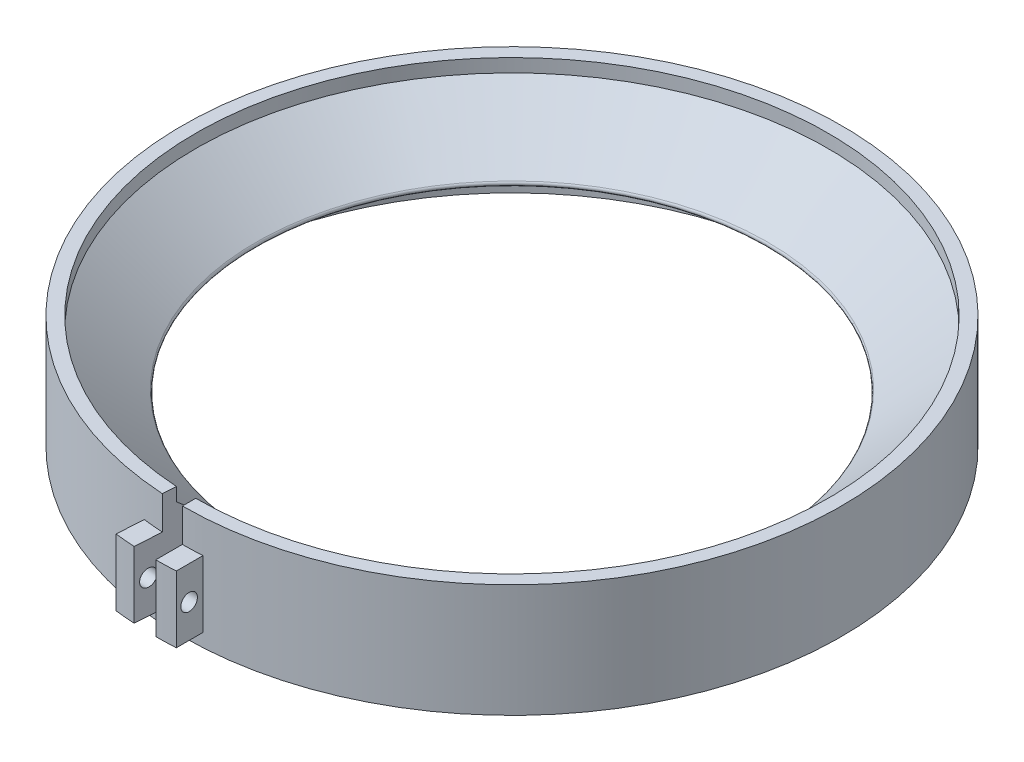
ISO-10303-21;
HEADER;
FILE_DESCRIPTION(('STEP AP214'),'2;1');
FILE_NAME('part.step','',(''),(''),'','','');
FILE_SCHEMA(('AUTOMOTIVE_DESIGN { 1 0 10303 214 1 1 1 1 }'));
ENDSEC;
DATA;
#1=APPLICATION_CONTEXT('core data for automotive mechanical design processes');
#2=APPLICATION_PROTOCOL_DEFINITION('international standard','automotive_design',2000,#1);
#3=PRODUCT_CONTEXT('',#1,'mechanical');
#4=PRODUCT('Part','Part','',(#3));
#5=PRODUCT_RELATED_PRODUCT_CATEGORY('part','',(#4));
#6=PRODUCT_DEFINITION_FORMATION('','',#4);
#7=PRODUCT_DEFINITION_CONTEXT('part definition',#1,'design');
#8=PRODUCT_DEFINITION('design','',#6,#7);
#9=PRODUCT_DEFINITION_SHAPE('','',#8);
#10=(LENGTH_UNIT() NAMED_UNIT(*) SI_UNIT(.MILLI.,.METRE.));
#11=(NAMED_UNIT(*) PLANE_ANGLE_UNIT() SI_UNIT($,.RADIAN.));
#12=(NAMED_UNIT(*) SI_UNIT($,.STERADIAN.) SOLID_ANGLE_UNIT());
#13=UNCERTAINTY_MEASURE_WITH_UNIT(LENGTH_MEASURE(1.E-05),#10,'distance_accuracy_value','');
#14=(GEOMETRIC_REPRESENTATION_CONTEXT(3) GLOBAL_UNCERTAINTY_ASSIGNED_CONTEXT((#13)) GLOBAL_UNIT_ASSIGNED_CONTEXT((#10,
#11,#12)) REPRESENTATION_CONTEXT('',''));
#15=CARTESIAN_POINT('',(0.,0.,0.));
#16=DIRECTION('',(0.,0.,1.));
#17=DIRECTION('',(1.,0.,0.));
#18=AXIS2_PLACEMENT_3D('',#15,#16,#17);
#19=CARTESIAN_POINT('',(38.6587532118802,150.091995488679,0.));
#20=DIRECTION('',(0.,-1.,0.));
#21=DIRECTION('',(0.,0.,-1.));
#22=AXIS2_PLACEMENT_3D('',#19,#20,#21);
#23=CYLINDRICAL_SURFACE('',#22,49.53);
#24=DIRECTION('',(0.,-1.,0.));
#25=VECTOR('',#24,1.);
#26=CARTESIAN_POINT('',(38.6587532118802,150.091995488679,49.53));
#27=LINE('',#26,#25);
#28=CARTESIAN_POINT('',(38.6587532118802,10.,49.53));
#29=VERTEX_POINT('',#28);
#30=CARTESIAN_POINT('',(38.6587532118802,5.00000000000006,49.53));
#31=VERTEX_POINT('',#30);
#32=EDGE_CURVE('E261',#29,#31,#27,.T.);
#33=ORIENTED_EDGE('',*,*,#32,.T.);
#34=CARTESIAN_POINT('',(38.6587532118802,5.,0.));
#35=DIRECTION('',(0.,1.,0.));
#36=DIRECTION('',(0.,0.,1.));
#37=AXIS2_PLACEMENT_3D('',#34,#35,#36);
#38=CIRCLE('',#37,49.53);
#39=CARTESIAN_POINT('',(41.6587532118802,5.,49.4390624911112));
#40=VERTEX_POINT('',#39);
#41=EDGE_CURVE('E65',#31,#40,#38,.T.);
#42=ORIENTED_EDGE('',*,*,#41,.T.);
#43=DIRECTION('',(0.,-1.,0.));
#44=VECTOR('',#43,1.);
#45=CARTESIAN_POINT('',(41.6587532118802,5.,49.4390624911112));
#46=LINE('',#45,#44);
#47=CARTESIAN_POINT('',(41.6587532118802,-5.,49.4390624911112));
#48=VERTEX_POINT('',#47);
#49=EDGE_CURVE('E70',#40,#48,#46,.T.);
#50=ORIENTED_EDGE('',*,*,#49,.T.);
#51=CARTESIAN_POINT('',(38.6587532118802,-5.,0.));
#52=DIRECTION('',(0.,1.,0.));
#53=DIRECTION('',(0.,0.,1.));
#54=AXIS2_PLACEMENT_3D('',#51,#52,#53);
#55=CIRCLE('',#54,49.53);
#56=CARTESIAN_POINT('',(38.6587532118802,-5.,49.53));
#57=VERTEX_POINT('',#56);
#58=EDGE_CURVE('E180',#57,#48,#55,.T.);
#59=ORIENTED_EDGE('',*,*,#58,.F.);
#60=CARTESIAN_POINT('',(38.6587532118802,-7.00000000000001,49.53));
#61=VERTEX_POINT('',#60);
#62=EDGE_CURVE('E260',#57,#61,#27,.T.);
#63=ORIENTED_EDGE('',*,*,#62,.T.);
#64=CARTESIAN_POINT('',(38.6587532118802,-7.00000000000001,0.));
#65=DIRECTION('',(0.,-1.,0.));
#66=DIRECTION('',(0.,0.,-1.));
#67=AXIS2_PLACEMENT_3D('',#64,#65,#66);
#68=CIRCLE('',#67,49.53);
#69=CARTESIAN_POINT('',(35.5487387795933,-7.00000000000001,49.4322638590523));
#70=VERTEX_POINT('',#69);
#71=EDGE_CURVE('E304',#61,#70,#68,.F.);
#72=ORIENTED_EDGE('',*,*,#71,.T.);
#73=DIRECTION('',(0.,-1.,0.));
#74=VECTOR('',#73,1.);
#75=CARTESIAN_POINT('',(35.5487387795933,150.091995488679,49.4322638590523));
#76=LINE('',#75,#74);
#77=CARTESIAN_POINT('',(35.5487387795933,-4.99999999999995,49.4322638590523));
#78=VERTEX_POINT('',#77);
#79=EDGE_CURVE('E277',#70,#78,#76,.F.);
#80=ORIENTED_EDGE('',*,*,#79,.T.);
#81=CARTESIAN_POINT('',(38.6587532118802,-5.,0.));
#82=DIRECTION('',(0.,1.,0.));
#83=DIRECTION('',(0.,0.,1.));
#84=AXIS2_PLACEMENT_3D('',#81,#82,#83);
#85=CIRCLE('',#84,49.53);
#86=CARTESIAN_POINT('',(32.5603686077363,-5.,49.1531342359767));
#87=VERTEX_POINT('',#86);
#88=EDGE_CURVE('E212',#87,#78,#85,.T.);
#89=ORIENTED_EDGE('',*,*,#88,.F.);
#90=DIRECTION('',(0.,-1.,0.));
#91=VECTOR('',#90,1.);
#92=CARTESIAN_POINT('',(32.5603686077363,5.,49.1531342359767));
#93=LINE('',#92,#91);
#94=CARTESIAN_POINT('',(32.5603686077363,5.,49.1531342359767));
#95=VERTEX_POINT('',#94);
#96=EDGE_CURVE('E199',#95,#87,#93,.T.);
#97=ORIENTED_EDGE('',*,*,#96,.F.);
#98=CARTESIAN_POINT('',(38.6587532118802,5.,0.));
#99=DIRECTION('',(0.,1.,0.));
#100=DIRECTION('',(0.,0.,1.));
#101=AXIS2_PLACEMENT_3D('',#98,#99,#100);
#102=CIRCLE('',#101,49.53);
#103=CARTESIAN_POINT('',(35.5487387795933,5.,49.4322638590523));
#104=VERTEX_POINT('',#103);
#105=EDGE_CURVE('E228',#95,#104,#102,.T.);
#106=ORIENTED_EDGE('',*,*,#105,.T.);
#107=CARTESIAN_POINT('',(35.5487387795933,10.,49.4322638590523));
#108=VERTEX_POINT('',#107);
#109=EDGE_CURVE('E276',#104,#108,#76,.F.);
#110=ORIENTED_EDGE('',*,*,#109,.T.);
#111=CARTESIAN_POINT('',(38.6587532118802,10.,0.));
#112=DIRECTION('',(0.,1.,0.));
#113=DIRECTION('',(0.,0.,1.));
#114=AXIS2_PLACEMENT_3D('',#111,#112,#113);
#115=CIRCLE('',#114,49.53);
#116=EDGE_CURVE('E308',#29,#108,#115,.T.);
#117=ORIENTED_EDGE('',*,*,#116,.F.);
#118=EDGE_LOOP('',(#33,#42,#50,#59,#63,#72,#80,#89,#97,#106,#110,#117));
#119=FACE_BOUND('',#118,.T.);
#120=ADVANCED_FACE('F49',(#119),#23,.T.);
#121=CARTESIAN_POINT('',(38.6587532118802,10.,0.));
#122=DIRECTION('',(0.,1.,0.));
#123=DIRECTION('',(0.,0.,1.));
#124=AXIS2_PLACEMENT_3D('',#121,#122,#123);
#125=PLANE('',#124);
#126=DIRECTION('',(-0.0627905195293134,0.,0.998026728428272));
#127=VECTOR('',#126,1.);
#128=CARTESIAN_POINT('',(38.6587532118802,10.,0.));
#129=LINE('',#128,#127);
#130=CARTESIAN_POINT('',(35.6743198186519,10.,47.4362104021957));
#131=VERTEX_POINT('',#130);
#132=EDGE_CURVE('E186',#131,#108,#129,.T.);
#133=ORIENTED_EDGE('',*,*,#132,.F.);
#134=CARTESIAN_POINT('',(38.6587532118802,10.,0.));
#135=DIRECTION('',(0.,1.,0.));
#136=DIRECTION('',(0.,0.,1.));
#137=AXIS2_PLACEMENT_3D('',#134,#135,#136);
#138=CIRCLE('',#137,47.53);
#139=CARTESIAN_POINT('',(38.6587532118802,10.,47.53));
#140=VERTEX_POINT('',#139);
#141=EDGE_CURVE('E280',#140,#131,#138,.T.);
#142=ORIENTED_EDGE('',*,*,#141,.F.);
#143=DIRECTION('',(0.,0.,-1.));
#144=VECTOR('',#143,1.);
#145=CARTESIAN_POINT('',(38.6587532118802,10.,0.));
#146=LINE('',#145,#144);
#147=EDGE_CURVE('E191',#29,#140,#146,.T.);
#148=ORIENTED_EDGE('',*,*,#147,.F.);
#149=ORIENTED_EDGE('',*,*,#116,.T.);
#150=EDGE_LOOP('',(#133,#142,#148,#149));
#151=FACE_BOUND('',#150,.T.);
#152=ADVANCED_FACE('F51',(#151),#125,.T.);
#153=CARTESIAN_POINT('',(38.6587532118802,-7.,0.));
#154=DIRECTION('',(0.,-1.,0.));
#155=DIRECTION('',(0.,0.,-1.));
#156=AXIS2_PLACEMENT_3D('',#153,#154,#155);
#157=PLANE('',#156);
#158=DIRECTION('',(-0.0627905195293134,0.,0.998026728428272));
#159=VECTOR('',#158,1.);
#160=CARTESIAN_POINT('',(38.6587532118802,-7.00000000000001,0.));
#161=LINE('',#160,#159);
#162=CARTESIAN_POINT('',(35.7291845861991,-7.00000000000001,46.5641598940678));
#163=VERTEX_POINT('',#162);
#164=EDGE_CURVE('E240',#163,#70,#161,.T.);
#165=ORIENTED_EDGE('',*,*,#164,.T.);
#166=ORIENTED_EDGE('',*,*,#71,.F.);
#167=DIRECTION('',(0.,0.,-1.));
#168=VECTOR('',#167,1.);
#169=CARTESIAN_POINT('',(38.6587532118802,-7.00000000000001,0.));
#170=LINE('',#169,#168);
#171=CARTESIAN_POINT('',(38.6587532118802,-7.00000000000001,46.6562252970907));
#172=VERTEX_POINT('',#171);
#173=EDGE_CURVE('E244',#61,#172,#170,.T.);
#174=ORIENTED_EDGE('',*,*,#173,.T.);
#175=CARTESIAN_POINT('',(38.6587532118802,-7.,0.));
#176=DIRECTION('',(0.,-1.,0.));
#177=DIRECTION('',(0.,0.,-1.));
#178=AXIS2_PLACEMENT_3D('',#175,#176,#177);
#179=CIRCLE('',#178,46.6562252970907);
#180=EDGE_CURVE('E284',#163,#172,#179,.T.);
#181=ORIENTED_EDGE('',*,*,#180,.F.);
#182=EDGE_LOOP('',(#165,#166,#174,#181));
#183=FACE_BOUND('',#182,.T.);
#184=ADVANCED_FACE('F380',(#183),#157,.T.);
#185=CARTESIAN_POINT('',(38.6587532118802,0.0607805601653532,0.));
#186=DIRECTION('',(0.,1.,0.));
#187=DIRECTION('',(0.,0.,1.));
#188=AXIS2_PLACEMENT_3D('',#185,#186,#187);
#189=TOROIDAL_SURFACE('',#188,38.6906962409273,0.4);
#190=CARTESIAN_POINT('',(36.2293442939615,0.0607805601653532,38.6143489899447));
#191=DIRECTION('',(-0.998026728428272,0.,-0.0627905195293134));
#192=DIRECTION('',(-0.0627905195293134,0.,0.998026728428272));
#193=AXIS2_PLACEMENT_3D('',#190,#191,#192);
#194=CIRCLE('',#193,0.4);
#195=CARTESIAN_POINT('',(36.2419023978673,-0.285629601348425,38.4147436442591));
#196=VERTEX_POINT('',#195);
#197=CARTESIAN_POINT('',(36.2454886811452,0.367198337412951,38.3577413038769));
#198=VERTEX_POINT('',#197);
#199=EDGE_CURVE('E267',#196,#198,#194,.F.);
#200=ORIENTED_EDGE('',*,*,#199,.F.);
#201=CARTESIAN_POINT('',(38.6587532118802,-0.285629601348425,0.));
#202=DIRECTION('',(0.,-1.,0.));
#203=DIRECTION('',(0.,0.,-1.));
#204=AXIS2_PLACEMENT_3D('',#201,#202,#203);
#205=CIRCLE('',#204,38.4906962409273);
#206=CARTESIAN_POINT('',(38.6587532118802,-0.285629601348425,38.4906962409273));
#207=VERTEX_POINT('',#206);
#208=EDGE_CURVE('E292',#196,#207,#205,.T.);
#209=ORIENTED_EDGE('',*,*,#208,.T.);
#210=CARTESIAN_POINT('',(38.6587532118802,0.0607805601653532,38.6906962409273));
#211=DIRECTION('',(1.,0.,0.));
#212=DIRECTION('',(0.,0.,-1.));
#213=AXIS2_PLACEMENT_3D('',#210,#211,#212);
#214=CIRCLE('',#213,0.4);
#215=CARTESIAN_POINT('',(38.6587532118802,0.367198337412951,38.4335811970527));
#216=VERTEX_POINT('',#215);
#217=EDGE_CURVE('E251',#216,#207,#214,.F.);
#218=ORIENTED_EDGE('',*,*,#217,.F.);
#219=CARTESIAN_POINT('',(38.6587532118802,0.367198337412951,0.));
#220=DIRECTION('',(0.,1.,0.));
#221=DIRECTION('',(0.,0.,1.));
#222=AXIS2_PLACEMENT_3D('',#219,#220,#221);
#223=CIRCLE('',#222,38.4335811970527);
#224=EDGE_CURVE('E288',#216,#198,#223,.T.);
#225=ORIENTED_EDGE('',*,*,#224,.T.);
#226=EDGE_LOOP('',(#200,#209,#218,#225));
#227=FACE_BOUND('',#226,.T.);
#228=ADVANCED_FACE('F330',(#227),#189,.T.);
#229=CARTESIAN_POINT('',(38.6587532118802,-7.,0.));
#230=DIRECTION('',(0.,1.,0.));
#231=DIRECTION('',(0.,0.,1.));
#232=AXIS2_PLACEMENT_3D('',#229,#230,#231);
#233=CYLINDRICAL_SURFACE('',#232,46.6562252970907);
#234=DIRECTION('',(0.,1.,0.));
#235=VECTOR('',#234,1.);
#236=CARTESIAN_POINT('',(35.7291845861991,-7.,46.5641598940678));
#237=LINE('',#236,#235);
#238=CARTESIAN_POINT('',(35.7291845861991,-5.,46.5641598940678));
#239=VERTEX_POINT('',#238);
#240=EDGE_CURVE('E264',#163,#239,#237,.T.);
#241=ORIENTED_EDGE('',*,*,#240,.F.);
#242=ORIENTED_EDGE('',*,*,#180,.T.);
#243=DIRECTION('',(0.,1.,0.));
#244=VECTOR('',#243,1.);
#245=CARTESIAN_POINT('',(38.6587532118802,-7.,46.6562252970907));
#246=LINE('',#245,#244);
#247=CARTESIAN_POINT('',(38.6587532118802,-5.,46.6562252970907));
#248=VERTEX_POINT('',#247);
#249=EDGE_CURVE('E248',#248,#172,#246,.F.);
#250=ORIENTED_EDGE('',*,*,#249,.F.);
#251=CARTESIAN_POINT('',(38.6587532118802,-5.,0.));
#252=DIRECTION('',(0.,-1.,0.));
#253=DIRECTION('',(0.,0.,-1.));
#254=AXIS2_PLACEMENT_3D('',#251,#252,#253);
#255=CIRCLE('',#254,46.6562252970907);
#256=EDGE_CURVE('E296',#239,#248,#255,.T.);
#257=ORIENTED_EDGE('',*,*,#256,.F.);
#258=EDGE_LOOP('',(#241,#242,#250,#257));
#259=FACE_BOUND('',#258,.T.);
#260=ADVANCED_FACE('F321',(#259),#233,.F.);
#261=CARTESIAN_POINT('',(38.6587532118802,10.,0.));
#262=DIRECTION('',(0.,-1.,0.));
#263=DIRECTION('',(0.,0.,-1.));
#264=AXIS2_PLACEMENT_3D('',#261,#262,#263);
#265=CYLINDRICAL_SURFACE('',#264,47.53);
#266=DIRECTION('',(0.,-1.,0.));
#267=VECTOR('',#266,1.);
#268=CARTESIAN_POINT('',(35.6743198186519,10.,47.4362104021957));
#269=LINE('',#268,#267);
#270=CARTESIAN_POINT('',(35.6743198186519,8.,47.4362104021958));
#271=VERTEX_POINT('',#270);
#272=EDGE_CURVE('E273',#271,#131,#269,.F.);
#273=ORIENTED_EDGE('',*,*,#272,.F.);
#274=CARTESIAN_POINT('',(38.6587532118802,8.,0.));
#275=DIRECTION('',(0.,-1.,0.));
#276=DIRECTION('',(0.,0.,-1.));
#277=AXIS2_PLACEMENT_3D('',#274,#275,#276);
#278=CIRCLE('',#277,47.53);
#279=CARTESIAN_POINT('',(38.6587532118802,8.00000000000001,47.53));
#280=VERTEX_POINT('',#279);
#281=EDGE_CURVE('E300',#271,#280,#278,.T.);
#282=ORIENTED_EDGE('',*,*,#281,.T.);
#283=DIRECTION('',(0.,-1.,0.));
#284=VECTOR('',#283,1.);
#285=CARTESIAN_POINT('',(38.6587532118802,10.,47.53));
#286=LINE('',#285,#284);
#287=EDGE_CURVE('E257',#140,#280,#286,.T.);
#288=ORIENTED_EDGE('',*,*,#287,.F.);
#289=ORIENTED_EDGE('',*,*,#141,.T.);
#290=EDGE_LOOP('',(#273,#282,#288,#289));
#291=FACE_BOUND('',#290,.T.);
#292=ADVANCED_FACE('F339',(#291),#265,.F.);
#293=CARTESIAN_POINT('',(38.6587532118802,8.,0.));
#294=DIRECTION('',(0.,1.,0.));
#295=DIRECTION('',(0.,0.,1.));
#296=AXIS2_PLACEMENT_3D('',#293,#294,#295);
#297=CONICAL_SURFACE('',#296,47.53,0.872664625997171);
#298=DIRECTION('',(-0.0481003285659845,0.642787609686535,0.764532829396695));
#299=VECTOR('',#298,1.);
#300=CARTESIAN_POINT('',(38.6587532118802,-31.8824054698557,0.));
#301=LINE('',#300,#299);
#302=EDGE_CURVE('E270',#198,#271,#301,.T.);
#303=ORIENTED_EDGE('',*,*,#302,.F.);
#304=ORIENTED_EDGE('',*,*,#224,.F.);
#305=DIRECTION('',(0.,-0.642787609686535,-0.766044443118982));
#306=VECTOR('',#305,1.);
#307=CARTESIAN_POINT('',(38.6587532118802,-31.8824054698557,0.));
#308=LINE('',#307,#306);
#309=EDGE_CURVE('E254',#280,#216,#308,.T.);
#310=ORIENTED_EDGE('',*,*,#309,.F.);
#311=ORIENTED_EDGE('',*,*,#281,.F.);
#312=EDGE_LOOP('',(#303,#304,#310,#311));
#313=FACE_BOUND('',#312,.T.);
#314=ADVANCED_FACE('F334',(#313),#297,.F.);
#315=CARTESIAN_POINT('',(38.6587532118802,0.,0.));
#316=DIRECTION('',(0.,-1.,0.));
#317=DIRECTION('',(0.,0.,-1.));
#318=AXIS2_PLACEMENT_3D('',#315,#316,#317);
#319=CONICAL_SURFACE('',#318,37.9959712592462,1.0471975511966);
#320=DIRECTION('',(0.0543781850292085,0.499999999999995,-0.864316500474759));
#321=VECTOR('',#320,1.);
#322=CARTESIAN_POINT('',(38.6587532118802,21.9369842346468,0.));
#323=LINE('',#322,#321);
#324=EDGE_CURVE('E11',#239,#196,#323,.T.);
#325=ORIENTED_EDGE('',*,*,#324,.F.);
#326=ORIENTED_EDGE('',*,*,#256,.T.);
#327=DIRECTION('',(0.,-0.499999999999995,0.866025403784442));
#328=VECTOR('',#327,1.);
#329=CARTESIAN_POINT('',(38.6587532118802,21.9369842346468,0.));
#330=LINE('',#329,#328);
#331=EDGE_CURVE('E58',#207,#248,#330,.T.);
#332=ORIENTED_EDGE('',*,*,#331,.F.);
#333=ORIENTED_EDGE('',*,*,#208,.F.);
#334=EDGE_LOOP('',(#325,#326,#332,#333));
#335=FACE_BOUND('',#334,.T.);
#336=ADVANCED_FACE('F324',(#335),#319,.F.);
#337=CARTESIAN_POINT('',(38.6587532118802,-7.00000000000001,0.));
#338=DIRECTION('',(1.,0.,0.));
#339=DIRECTION('',(0.,0.,-1.));
#340=AXIS2_PLACEMENT_3D('',#337,#338,#339);
#341=PLANE('',#340);
#342=CARTESIAN_POINT('',(38.6587532118802,0.,51.5232107822321));
#343=DIRECTION('',(1.,0.,0.));
#344=DIRECTION('',(0.,0.,-1.));
#345=AXIS2_PLACEMENT_3D('',#342,#343,#344);
#346=CIRCLE('',#345,1.25);
#347=CARTESIAN_POINT('',(38.6587532118802,0.,50.2732107822321));
#348=VERTEX_POINT('',#347);
#349=EDGE_CURVE('E200',#348,#348,#346,.F.);
#350=ORIENTED_EDGE('',*,*,#349,.F.);
#351=EDGE_LOOP('',(#350));
#352=FACE_BOUND('',#351,.T.);
#353=ORIENTED_EDGE('',*,*,#147,.T.);
#354=ORIENTED_EDGE('',*,*,#287,.T.);
#355=ORIENTED_EDGE('',*,*,#309,.T.);
#356=ORIENTED_EDGE('',*,*,#217,.T.);
#357=ORIENTED_EDGE('',*,*,#331,.T.);
#358=ORIENTED_EDGE('',*,*,#249,.T.);
#359=ORIENTED_EDGE('',*,*,#173,.F.);
#360=ORIENTED_EDGE('',*,*,#62,.F.);
#361=DIRECTION('',(0.,0.,1.));
#362=VECTOR('',#361,1.);
#363=CARTESIAN_POINT('',(38.6587532118803,-5.,0.));
#364=LINE('',#363,#362);
#365=CARTESIAN_POINT('',(38.6587532118802,-5.,53.53));
#366=VERTEX_POINT('',#365);
#367=EDGE_CURVE('E184',#57,#366,#364,.T.);
#368=ORIENTED_EDGE('',*,*,#367,.T.);
#369=DIRECTION('',(0.,-1.,0.));
#370=VECTOR('',#369,1.);
#371=CARTESIAN_POINT('',(38.6587532118802,5.,53.53));
#372=LINE('',#371,#370);
#373=CARTESIAN_POINT('',(38.6587532118802,5.,53.53));
#374=VERTEX_POINT('',#373);
#375=EDGE_CURVE('E166',#374,#366,#372,.T.);
#376=ORIENTED_EDGE('',*,*,#375,.F.);
#377=DIRECTION('',(0.,0.,1.));
#378=VECTOR('',#377,1.);
#379=CARTESIAN_POINT('',(38.6587532118803,5.,0.));
#380=LINE('',#379,#378);
#381=EDGE_CURVE('E174',#31,#374,#380,.T.);
#382=ORIENTED_EDGE('',*,*,#381,.F.);
#383=ORIENTED_EDGE('',*,*,#32,.F.);
#384=EDGE_LOOP('',(#353,#354,#355,#356,#357,#358,#359,#360,#368,#376,#382,#383));
#385=FACE_BOUND('',#384,.T.);
#386=ADVANCED_FACE('F182',(#352,#385),#341,.F.);
#387=CARTESIAN_POINT('',(38.6587532118802,-7.00000000000001,0.));
#388=DIRECTION('',(-0.998026728428272,0.,-0.0627905195293134));
#389=DIRECTION('',(-0.0627905195293134,0.,0.998026728428272));
#390=AXIS2_PLACEMENT_3D('',#387,#388,#389);
#391=PLANE('',#390);
#392=CARTESIAN_POINT('',(35.4250457712566,0.,51.3983079269325));
#393=DIRECTION('',(-0.998026728428272,0.,-0.0627905195293134));
#394=DIRECTION('',(-0.0627905195293134,0.,0.998026728428272));
#395=AXIS2_PLACEMENT_3D('',#392,#393,#394);
#396=CIRCLE('',#395,1.25);
#397=CARTESIAN_POINT('',(35.3465576218449,0.,52.6458413374678));
#398=VERTEX_POINT('',#397);
#399=EDGE_CURVE('E429',#398,#398,#396,.F.);
#400=ORIENTED_EDGE('',*,*,#399,.F.);
#401=EDGE_LOOP('',(#400));
#402=FACE_BOUND('',#401,.T.);
#403=ORIENTED_EDGE('',*,*,#164,.F.);
#404=ORIENTED_EDGE('',*,*,#240,.T.);
#405=ORIENTED_EDGE('',*,*,#324,.T.);
#406=ORIENTED_EDGE('',*,*,#199,.T.);
#407=ORIENTED_EDGE('',*,*,#302,.T.);
#408=ORIENTED_EDGE('',*,*,#272,.T.);
#409=ORIENTED_EDGE('',*,*,#132,.T.);
#410=ORIENTED_EDGE('',*,*,#109,.F.);
#411=DIRECTION('',(-0.0627905195293102,0.,0.998026728428272));
#412=VECTOR('',#411,1.);
#413=CARTESIAN_POINT('',(35.5487387795933,5.,49.4322638590523));
#414=LINE('',#413,#412);
#415=CARTESIAN_POINT('',(35.297576701476,5.,53.4243707727654));
#416=VERTEX_POINT('',#415);
#417=EDGE_CURVE('E232',#104,#416,#414,.T.);
#418=ORIENTED_EDGE('',*,*,#417,.T.);
#419=DIRECTION('',(0.,-1.,0.));
#420=VECTOR('',#419,1.);
#421=CARTESIAN_POINT('',(35.297576701476,5.,53.4243707727654));
#422=LINE('',#421,#420);
#423=CARTESIAN_POINT('',(35.297576701476,-5.,53.4243707727654));
#424=VERTEX_POINT('',#423);
#425=EDGE_CURVE('E196',#416,#424,#422,.T.);
#426=ORIENTED_EDGE('',*,*,#425,.T.);
#427=DIRECTION('',(-0.0627905195293102,0.,0.998026728428272));
#428=VECTOR('',#427,1.);
#429=CARTESIAN_POINT('',(35.5487387795933,-5.,49.4322638590523));
#430=LINE('',#429,#428);
#431=EDGE_CURVE('E217',#78,#424,#430,.T.);
#432=ORIENTED_EDGE('',*,*,#431,.F.);
#433=ORIENTED_EDGE('',*,*,#79,.F.);
#434=EDGE_LOOP('',(#403,#404,#405,#406,#407,#408,#409,#410,#418,#426,#432,#433));
#435=FACE_BOUND('',#434,.T.);
#436=ADVANCED_FACE('F327',(#402,#435),#391,.F.);
#437=CARTESIAN_POINT('',(38.6587532118802,5.,0.));
#438=DIRECTION('',(0.,-1.,0.));
#439=DIRECTION('',(0.,0.,-1.));
#440=AXIS2_PLACEMENT_3D('',#437,#438,#439);
#441=CYLINDRICAL_SURFACE('',#440,53.53);
#442=CARTESIAN_POINT('',(38.6587532118802,-5.,0.));
#443=DIRECTION('',(0.,1.,0.));
#444=DIRECTION('',(0.,0.,1.));
#445=AXIS2_PLACEMENT_3D('',#442,#443,#444);
#446=CIRCLE('',#445,53.53);
#447=CARTESIAN_POINT('',(32.3087791531232,-5.,53.1520341045676));
#448=VERTEX_POINT('',#447);
#449=EDGE_CURVE('E221',#448,#424,#446,.T.);
#450=ORIENTED_EDGE('',*,*,#449,.T.);
#451=ORIENTED_EDGE('',*,*,#425,.F.);
#452=CARTESIAN_POINT('',(38.6587532118802,5.,0.));
#453=DIRECTION('',(0.,1.,0.));
#454=DIRECTION('',(0.,0.,1.));
#455=AXIS2_PLACEMENT_3D('',#452,#453,#454);
#456=CIRCLE('',#455,53.53);
#457=CARTESIAN_POINT('',(32.3087791531232,5.,53.1520341045676));
#458=VERTEX_POINT('',#457);
#459=EDGE_CURVE('E213',#458,#416,#456,.T.);
#460=ORIENTED_EDGE('',*,*,#459,.F.);
#461=DIRECTION('',(0.,-1.,0.));
#462=VECTOR('',#461,1.);
#463=CARTESIAN_POINT('',(32.3087791531232,5.,53.1520341045676));
#464=LINE('',#463,#462);
#465=EDGE_CURVE('E204',#458,#448,#464,.T.);
#466=ORIENTED_EDGE('',*,*,#465,.T.);
#467=EDGE_LOOP('',(#450,#451,#460,#466));
#468=FACE_BOUND('',#467,.T.);
#469=ADVANCED_FACE('F354',(#468),#441,.T.);
#470=CARTESIAN_POINT('',(32.3087791531232,5.,53.1520341045676));
#471=DIRECTION('',(-0.998026728428272,0.,-0.0627905195293095));
#472=DIRECTION('',(-0.0627905195293095,0.,0.998026728428272));
#473=AXIS2_PLACEMENT_3D('',#470,#471,#472);
#474=PLANE('',#473);
#475=CARTESIAN_POINT('',(32.4309655859718,0.,51.2099363683446));
#476=DIRECTION('',(-0.998026728428272,0.,-0.0627905195293095));
#477=DIRECTION('',(-0.0627905195293095,0.,0.998026728428272));
#478=AXIS2_PLACEMENT_3D('',#475,#476,#477);
#479=CIRCLE('',#478,1.25);
#480=CARTESIAN_POINT('',(32.3524774365602,0.,52.4574697788799));
#481=VERTEX_POINT('',#480);
#482=EDGE_CURVE('E426',#481,#481,#479,.T.);
#483=ORIENTED_EDGE('',*,*,#482,.F.);
#484=EDGE_LOOP('',(#483));
#485=FACE_BOUND('',#484,.T.);
#486=DIRECTION('',(0.0627905195293095,0.,-0.998026728428272));
#487=VECTOR('',#486,1.);
#488=CARTESIAN_POINT('',(32.3087791531232,-5.,53.1520341045676));
#489=LINE('',#488,#487);
#490=EDGE_CURVE('E208',#448,#87,#489,.T.);
#491=ORIENTED_EDGE('',*,*,#490,.F.);
#492=ORIENTED_EDGE('',*,*,#465,.F.);
#493=DIRECTION('',(0.0627905195293095,0.,-0.998026728428272));
#494=VECTOR('',#493,1.);
#495=CARTESIAN_POINT('',(32.3087791531232,5.,53.1520341045676));
#496=LINE('',#495,#494);
#497=EDGE_CURVE('E207',#458,#95,#496,.T.);
#498=ORIENTED_EDGE('',*,*,#497,.T.);
#499=ORIENTED_EDGE('',*,*,#96,.T.);
#500=EDGE_LOOP('',(#491,#492,#498,#499));
#501=FACE_BOUND('',#500,.T.);
#502=ADVANCED_FACE('F361',(#485,#501),#474,.T.);
#503=CARTESIAN_POINT('',(38.6587532118802,5.,0.));
#504=DIRECTION('',(0.,1.,0.));
#505=DIRECTION('',(0.,0.,1.));
#506=AXIS2_PLACEMENT_3D('',#503,#504,#505);
#507=PLANE('',#506);
#508=ORIENTED_EDGE('',*,*,#459,.T.);
#509=ORIENTED_EDGE('',*,*,#417,.F.);
#510=ORIENTED_EDGE('',*,*,#105,.F.);
#511=ORIENTED_EDGE('',*,*,#497,.F.);
#512=EDGE_LOOP('',(#508,#509,#510,#511));
#513=FACE_BOUND('',#512,.T.);
#514=ADVANCED_FACE('F350',(#513),#507,.T.);
#515=CARTESIAN_POINT('',(38.6587532118802,-5.,0.));
#516=DIRECTION('',(0.,1.,0.));
#517=DIRECTION('',(0.,0.,1.));
#518=AXIS2_PLACEMENT_3D('',#515,#516,#517);
#519=PLANE('',#518);
#520=ORIENTED_EDGE('',*,*,#449,.F.);
#521=ORIENTED_EDGE('',*,*,#490,.T.);
#522=ORIENTED_EDGE('',*,*,#88,.T.);
#523=ORIENTED_EDGE('',*,*,#431,.T.);
#524=EDGE_LOOP('',(#520,#521,#522,#523));
#525=FACE_BOUND('',#524,.T.);
#526=ADVANCED_FACE('F358',(#525),#519,.F.);
#527=CARTESIAN_POINT('',(38.6587532118802,5.,0.));
#528=DIRECTION('',(0.,-1.,0.));
#529=DIRECTION('',(0.,0.,-1.));
#530=AXIS2_PLACEMENT_3D('',#527,#528,#529);
#531=CYLINDRICAL_SURFACE('',#530,53.53);
#532=CARTESIAN_POINT('',(38.6587532118802,-5.,0.));
#533=DIRECTION('',(0.,1.,0.));
#534=DIRECTION('',(0.,0.,1.));
#535=AXIS2_PLACEMENT_3D('',#532,#533,#534);
#536=CIRCLE('',#535,53.53);
#537=CARTESIAN_POINT('',(41.6587532118802,-5.,53.4458688768365));
#538=VERTEX_POINT('',#537);
#539=EDGE_CURVE('E448',#366,#538,#536,.T.);
#540=ORIENTED_EDGE('',*,*,#539,.T.);
#541=DIRECTION('',(0.,-1.,0.));
#542=VECTOR('',#541,1.);
#543=CARTESIAN_POINT('',(41.6587532118802,5.,53.4458688768365));
#544=LINE('',#543,#542);
#545=CARTESIAN_POINT('',(41.6587532118802,5.,53.4458688768365));
#546=VERTEX_POINT('',#545);
#547=EDGE_CURVE('E169',#546,#538,#544,.T.);
#548=ORIENTED_EDGE('',*,*,#547,.F.);
#549=CARTESIAN_POINT('',(38.6587532118802,5.,0.));
#550=DIRECTION('',(0.,1.,0.));
#551=DIRECTION('',(0.,0.,1.));
#552=AXIS2_PLACEMENT_3D('',#549,#550,#551);
#553=CIRCLE('',#552,53.53);
#554=EDGE_CURVE('E162',#374,#546,#553,.T.);
#555=ORIENTED_EDGE('',*,*,#554,.F.);
#556=ORIENTED_EDGE('',*,*,#375,.T.);
#557=EDGE_LOOP('',(#540,#548,#555,#556));
#558=FACE_BOUND('',#557,.T.);
#559=ADVANCED_FACE('F164',(#558),#531,.T.);
#560=CARTESIAN_POINT('',(41.6587532118802,5.,0.));
#561=DIRECTION('',(-1.,0.,0.));
#562=DIRECTION('',(0.,0.,1.));
#563=AXIS2_PLACEMENT_3D('',#560,#561,#562);
#564=PLANE('',#563);
#565=CARTESIAN_POINT('',(41.6587532118802,0.,51.5232107822321));
#566=DIRECTION('',(1.,0.,0.));
#567=DIRECTION('',(0.,0.,-1.));
#568=AXIS2_PLACEMENT_3D('',#565,#566,#567);
#569=CIRCLE('',#568,1.25);
#570=CARTESIAN_POINT('',(41.6587532118802,0.,50.2732107822321));
#571=VERTEX_POINT('',#570);
#572=EDGE_CURVE('E431',#571,#571,#569,.T.);
#573=ORIENTED_EDGE('',*,*,#572,.F.);
#574=EDGE_LOOP('',(#573));
#575=FACE_BOUND('',#574,.T.);
#576=DIRECTION('',(0.,0.,-1.));
#577=VECTOR('',#576,1.);
#578=CARTESIAN_POINT('',(41.6587532118802,-5.,0.));
#579=LINE('',#578,#577);
#580=EDGE_CURVE('E451',#538,#48,#579,.T.);
#581=ORIENTED_EDGE('',*,*,#580,.T.);
#582=ORIENTED_EDGE('',*,*,#49,.F.);
#583=DIRECTION('',(0.,0.,-1.));
#584=VECTOR('',#583,1.);
#585=CARTESIAN_POINT('',(41.6587532118802,5.,0.));
#586=LINE('',#585,#584);
#587=EDGE_CURVE('E173',#546,#40,#586,.T.);
#588=ORIENTED_EDGE('',*,*,#587,.F.);
#589=ORIENTED_EDGE('',*,*,#547,.T.);
#590=EDGE_LOOP('',(#581,#582,#588,#589));
#591=FACE_BOUND('',#590,.T.);
#592=ADVANCED_FACE('F402',(#575,#591),#564,.F.);
#593=CARTESIAN_POINT('',(0.,5.,0.));
#594=DIRECTION('',(0.,1.,0.));
#595=DIRECTION('',(0.,0.,1.));
#596=AXIS2_PLACEMENT_3D('',#593,#594,#595);
#597=PLANE('',#596);
#598=ORIENTED_EDGE('',*,*,#381,.T.);
#599=ORIENTED_EDGE('',*,*,#554,.T.);
#600=ORIENTED_EDGE('',*,*,#587,.T.);
#601=ORIENTED_EDGE('',*,*,#41,.F.);
#602=EDGE_LOOP('',(#598,#599,#600,#601));
#603=FACE_BOUND('',#602,.T.);
#604=ADVANCED_FACE('F177',(#603),#597,.T.);
#605=CARTESIAN_POINT('',(0.,-5.,0.));
#606=DIRECTION('',(0.,1.,0.));
#607=DIRECTION('',(0.,0.,1.));
#608=AXIS2_PLACEMENT_3D('',#605,#606,#607);
#609=PLANE('',#608);
#610=ORIENTED_EDGE('',*,*,#367,.F.);
#611=ORIENTED_EDGE('',*,*,#58,.T.);
#612=ORIENTED_EDGE('',*,*,#580,.F.);
#613=ORIENTED_EDGE('',*,*,#539,.F.);
#614=EDGE_LOOP('',(#610,#611,#612,#613));
#615=FACE_BOUND('',#614,.T.);
#616=ADVANCED_FACE('F411',(#615),#609,.F.);
#617=CARTESIAN_POINT('',(-10.8722467881198,0.,51.5232107822321));
#618=DIRECTION('',(1.,0.,0.));
#619=DIRECTION('',(0.,0.,-1.));
#620=AXIS2_PLACEMENT_3D('',#617,#618,#619);
#621=CYLINDRICAL_SURFACE('',#620,1.25);
#622=ORIENTED_EDGE('',*,*,#572,.T.);
#623=EDGE_LOOP('',(#622));
#624=FACE_BOUND('',#623,.T.);
#625=ORIENTED_EDGE('',*,*,#349,.T.);
#626=EDGE_LOOP('',(#625));
#627=FACE_BOUND('',#626,.T.);
#628=ADVANCED_FACE('F414',(#624,#627),#621,.F.);
#629=CARTESIAN_POINT('',(88.1153690696257,0.,54.7133020847364));
#630=DIRECTION('',(-0.998026728428272,0.,-0.0627905195293095));
#631=DIRECTION('',(-0.0627905195293095,0.,0.998026728428272));
#632=AXIS2_PLACEMENT_3D('',#629,#630,#631);
#633=CYLINDRICAL_SURFACE('',#632,1.25);
#634=ORIENTED_EDGE('',*,*,#482,.T.);
#635=EDGE_LOOP('',(#634));
#636=FACE_BOUND('',#635,.T.);
#637=ORIENTED_EDGE('',*,*,#399,.T.);
#638=EDGE_LOOP('',(#637));
#639=FACE_BOUND('',#638,.T.);
#640=ADVANCED_FACE('F419',(#636,#639),#633,.F.);
#641=CLOSED_SHELL('',(#120,#152,#184,#228,#260,#292,#314,#336,#386,#436,#469,#502,#514,#526,
#559,#592,#604,#616,#628,#640));
#642=MANIFOLD_SOLID_BREP('B2',#641);
#643=ADVANCED_BREP_SHAPE_REPRESENTATION('',(#18,#642),#14);
#644=SHAPE_DEFINITION_REPRESENTATION(#9,#643);
ENDSEC;
END-ISO-10303-21;
